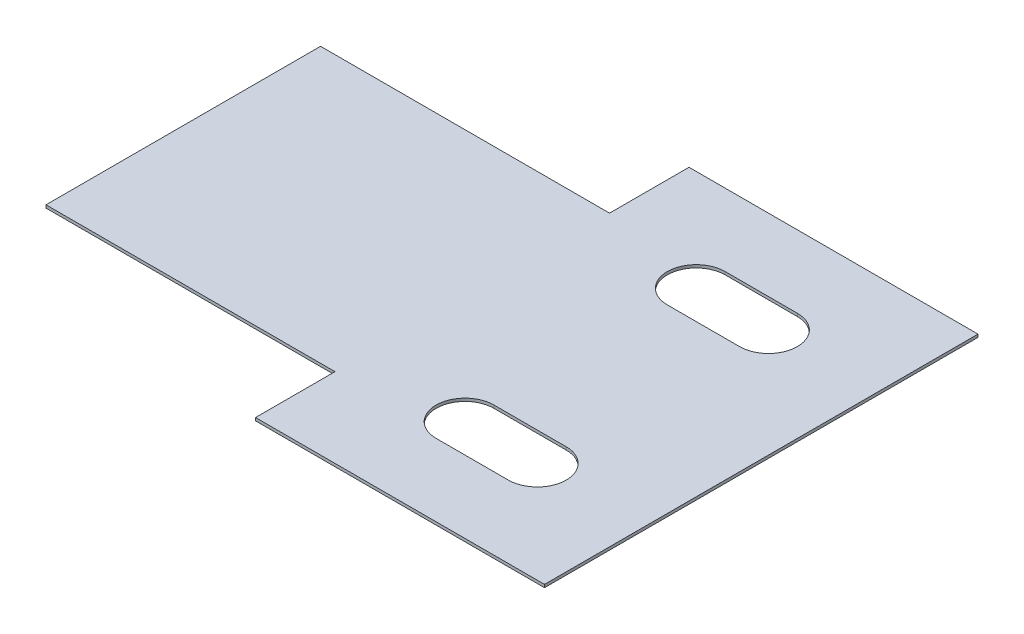
ISO-10303-21;
HEADER;
FILE_DESCRIPTION(('STEP AP214'),'2;1');
FILE_NAME('part.step','',(''),(''),'','','');
FILE_SCHEMA(('AUTOMOTIVE_DESIGN { 1 0 10303 214 1 1 1 1 }'));
ENDSEC;
DATA;
#1=APPLICATION_CONTEXT('core data for automotive mechanical design processes');
#2=APPLICATION_PROTOCOL_DEFINITION('international standard','automotive_design',2000,#1);
#3=PRODUCT_CONTEXT('',#1,'mechanical');
#4=PRODUCT('Part','Part','',(#3));
#5=PRODUCT_RELATED_PRODUCT_CATEGORY('part','',(#4));
#6=PRODUCT_DEFINITION_FORMATION('','',#4);
#7=PRODUCT_DEFINITION_CONTEXT('part definition',#1,'design');
#8=PRODUCT_DEFINITION('design','',#6,#7);
#9=PRODUCT_DEFINITION_SHAPE('','',#8);
#10=(LENGTH_UNIT() NAMED_UNIT(*) SI_UNIT(.MILLI.,.METRE.));
#11=(NAMED_UNIT(*) PLANE_ANGLE_UNIT() SI_UNIT($,.RADIAN.));
#12=(NAMED_UNIT(*) SI_UNIT($,.STERADIAN.) SOLID_ANGLE_UNIT());
#13=UNCERTAINTY_MEASURE_WITH_UNIT(LENGTH_MEASURE(1.E-05),#10,'distance_accuracy_value','');
#14=(GEOMETRIC_REPRESENTATION_CONTEXT(3) GLOBAL_UNCERTAINTY_ASSIGNED_CONTEXT((#13)) GLOBAL_UNIT_ASSIGNED_CONTEXT((#10,
#11,#12)) REPRESENTATION_CONTEXT('',''));
#15=CARTESIAN_POINT('',(0.,0.,0.));
#16=DIRECTION('',(0.,0.,1.));
#17=DIRECTION('',(1.,0.,0.));
#18=AXIS2_PLACEMENT_3D('',#15,#16,#17);
#19=CARTESIAN_POINT('',(0.,0.05,0.));
#20=DIRECTION('',(0.,1.,0.));
#21=DIRECTION('',(0.,0.,1.));
#22=AXIS2_PLACEMENT_3D('',#19,#20,#21);
#23=PLANE('',#22);
#24=DIRECTION('',(0.,0.,1.));
#25=VECTOR('',#24,1.);
#26=CARTESIAN_POINT('',(-3.77881475280006,0.05,-3.71273882483503));
#27=LINE('',#26,#25);
#28=CARTESIAN_POINT('',(-3.77881475280006,0.05,-3.71273882483503));
#29=VERTEX_POINT('',#28);
#30=CARTESIAN_POINT('',(-3.77881475280006,0.05,5.78726117516497));
#31=VERTEX_POINT('',#30);
#32=EDGE_CURVE('E244',#29,#31,#27,.T.);
#33=ORIENTED_EDGE('',*,*,#32,.T.);
#34=DIRECTION('',(1.,0.,0.));
#35=VECTOR('',#34,1.);
#36=CARTESIAN_POINT('',(-3.77881475280006,0.05,5.78726117516497));
#37=LINE('',#36,#35);
#38=CARTESIAN_POINT('',(6.22118524719994,0.05,5.78726117516497));
#39=VERTEX_POINT('',#38);
#40=EDGE_CURVE('E248',#31,#39,#37,.T.);
#41=ORIENTED_EDGE('',*,*,#40,.T.);
#42=DIRECTION('',(0.,0.,1.));
#43=VECTOR('',#42,1.);
#44=CARTESIAN_POINT('',(6.22118524719994,0.05,5.78726117516497));
#45=LINE('',#44,#43);
#46=CARTESIAN_POINT('',(6.22118524719994,0.05,8.53726117516497));
#47=VERTEX_POINT('',#46);
#48=EDGE_CURVE('E252',#39,#47,#45,.T.);
#49=ORIENTED_EDGE('',*,*,#48,.T.);
#50=DIRECTION('',(1.,0.,0.));
#51=VECTOR('',#50,1.);
#52=CARTESIAN_POINT('',(6.22118524719994,0.05,8.53726117516497));
#53=LINE('',#52,#51);
#54=CARTESIAN_POINT('',(16.2211852471999,0.05,8.53726117516497));
#55=VERTEX_POINT('',#54);
#56=EDGE_CURVE('E255',#47,#55,#53,.T.);
#57=ORIENTED_EDGE('',*,*,#56,.T.);
#58=DIRECTION('',(0.,0.,-1.));
#59=VECTOR('',#58,1.);
#60=CARTESIAN_POINT('',(16.2211852471999,0.05,8.53726117516497));
#61=LINE('',#60,#59);
#62=CARTESIAN_POINT('',(16.2211852471999,0.05,-6.46273882483503));
#63=VERTEX_POINT('',#62);
#64=EDGE_CURVE('E258',#55,#63,#61,.T.);
#65=ORIENTED_EDGE('',*,*,#64,.T.);
#66=DIRECTION('',(-1.,0.,0.));
#67=VECTOR('',#66,1.);
#68=CARTESIAN_POINT('',(16.2211852471999,0.05,-6.46273882483503));
#69=LINE('',#68,#67);
#70=CARTESIAN_POINT('',(6.22118524719994,0.05,-6.46273882483503));
#71=VERTEX_POINT('',#70);
#72=EDGE_CURVE('E261',#63,#71,#69,.T.);
#73=ORIENTED_EDGE('',*,*,#72,.T.);
#74=DIRECTION('',(0.,0.,1.));
#75=VECTOR('',#74,1.);
#76=CARTESIAN_POINT('',(6.22118524719994,0.05,-6.46273882483503));
#77=LINE('',#76,#75);
#78=CARTESIAN_POINT('',(6.22118524719994,0.05,-3.71273882483503));
#79=VERTEX_POINT('',#78);
#80=EDGE_CURVE('E264',#71,#79,#77,.T.);
#81=ORIENTED_EDGE('',*,*,#80,.T.);
#82=DIRECTION('',(-1.,0.,0.));
#83=VECTOR('',#82,1.);
#84=CARTESIAN_POINT('',(6.22118524719994,0.05,-3.71273882483503));
#85=LINE('',#84,#83);
#86=EDGE_CURVE('E267',#79,#29,#85,.T.);
#87=ORIENTED_EDGE('',*,*,#86,.T.);
#88=EDGE_LOOP('',(#33,#41,#49,#57,#65,#73,#81,#87));
#89=FACE_BOUND('',#88,.T.);
#90=DIRECTION('',(-1.,0.,0.));
#91=VECTOR('',#90,1.);
#92=CARTESIAN_POINT('',(12.4711852471999,0.05,-3.96273882483504));
#93=LINE('',#92,#91);
#94=CARTESIAN_POINT('',(12.4711852471999,0.05,-3.96273882483504));
#95=VERTEX_POINT('',#94);
#96=CARTESIAN_POINT('',(9.97118524719994,0.05,-3.96273882483504));
#97=VERTEX_POINT('',#96);
#98=EDGE_CURVE('E204',#95,#97,#93,.T.);
#99=ORIENTED_EDGE('',*,*,#98,.F.);
#100=CARTESIAN_POINT('',(12.4711852471999,0.05,-2.96273882483504));
#101=DIRECTION('',(0.,1.,0.));
#102=DIRECTION('',(0.,0.,1.));
#103=AXIS2_PLACEMENT_3D('',#100,#101,#102);
#104=CIRCLE('',#103,1.);
#105=CARTESIAN_POINT('',(12.4711852471999,0.05,-1.96273882483503));
#106=VERTEX_POINT('',#105);
#107=EDGE_CURVE('E201',#106,#95,#104,.T.);
#108=ORIENTED_EDGE('',*,*,#107,.F.);
#109=DIRECTION('',(1.,0.,0.));
#110=VECTOR('',#109,1.);
#111=CARTESIAN_POINT('',(9.97118524719994,0.05,-1.96273882483503));
#112=LINE('',#111,#110);
#113=CARTESIAN_POINT('',(9.97118524719994,0.05,-1.96273882483503));
#114=VERTEX_POINT('',#113);
#115=EDGE_CURVE('E212',#114,#106,#112,.T.);
#116=ORIENTED_EDGE('',*,*,#115,.F.);
#117=CARTESIAN_POINT('',(9.97118524719994,0.05,-2.96273882483504));
#118=DIRECTION('',(0.,1.,0.));
#119=DIRECTION('',(0.,0.,1.));
#120=AXIS2_PLACEMENT_3D('',#117,#118,#119);
#121=CIRCLE('',#120,1.);
#122=EDGE_CURVE('E208',#97,#114,#121,.T.);
#123=ORIENTED_EDGE('',*,*,#122,.F.);
#124=EDGE_LOOP('',(#99,#108,#116,#123));
#125=FACE_BOUND('',#124,.T.);
#126=DIRECTION('',(-1.,0.,0.));
#127=VECTOR('',#126,1.);
#128=CARTESIAN_POINT('',(12.4711852471999,0.05,4.03726117516496));
#129=LINE('',#128,#127);
#130=CARTESIAN_POINT('',(12.4711852471999,0.05,4.03726117516496));
#131=VERTEX_POINT('',#130);
#132=CARTESIAN_POINT('',(9.97118524719994,0.05,4.03726117516497));
#133=VERTEX_POINT('',#132);
#134=EDGE_CURVE('E162',#131,#133,#129,.T.);
#135=ORIENTED_EDGE('',*,*,#134,.F.);
#136=CARTESIAN_POINT('',(12.4711852471999,0.05,5.03726117516497));
#137=DIRECTION('',(0.,1.,0.));
#138=DIRECTION('',(0.,0.,1.));
#139=AXIS2_PLACEMENT_3D('',#136,#137,#138);
#140=CIRCLE('',#139,1.);
#141=CARTESIAN_POINT('',(12.4711852471999,0.05,6.03726117516497));
#142=VERTEX_POINT('',#141);
#143=EDGE_CURVE('E153',#142,#131,#140,.T.);
#144=ORIENTED_EDGE('',*,*,#143,.F.);
#145=DIRECTION('',(1.,0.,0.));
#146=VECTOR('',#145,1.);
#147=CARTESIAN_POINT('',(9.97118524719994,0.05,6.03726117516497));
#148=LINE('',#147,#146);
#149=CARTESIAN_POINT('',(9.97118524719994,0.05,6.03726117516497));
#150=VERTEX_POINT('',#149);
#151=EDGE_CURVE('E179',#150,#142,#148,.T.);
#152=ORIENTED_EDGE('',*,*,#151,.F.);
#153=CARTESIAN_POINT('',(9.97118524719994,0.05,5.03726117516497));
#154=DIRECTION('',(0.,1.,0.));
#155=DIRECTION('',(0.,0.,1.));
#156=AXIS2_PLACEMENT_3D('',#153,#154,#155);
#157=CIRCLE('',#156,1.);
#158=EDGE_CURVE('E175',#133,#150,#157,.T.);
#159=ORIENTED_EDGE('',*,*,#158,.F.);
#160=EDGE_LOOP('',(#135,#144,#152,#159));
#161=FACE_BOUND('',#160,.T.);
#162=ADVANCED_FACE('F39',(#89,#125,#161),#23,.T.);
#163=CARTESIAN_POINT('',(0.,-0.05,0.));
#164=DIRECTION('',(0.,1.,0.));
#165=DIRECTION('',(0.,0.,1.));
#166=AXIS2_PLACEMENT_3D('',#163,#164,#165);
#167=PLANE('',#166);
#168=CARTESIAN_POINT('',(12.4711852471999,-0.05,-2.96273882483504));
#169=DIRECTION('',(0.,1.,0.));
#170=DIRECTION('',(0.,0.,1.));
#171=AXIS2_PLACEMENT_3D('',#168,#169,#170);
#172=CIRCLE('',#171,1.);
#173=CARTESIAN_POINT('',(12.4711852471999,-0.05,-1.96273882483503));
#174=VERTEX_POINT('',#173);
#175=CARTESIAN_POINT('',(12.4711852471999,-0.05,-3.96273882483504));
#176=VERTEX_POINT('',#175);
#177=EDGE_CURVE('E171',#174,#176,#172,.T.);
#178=ORIENTED_EDGE('',*,*,#177,.T.);
#179=DIRECTION('',(-1.,0.,0.));
#180=VECTOR('',#179,1.);
#181=CARTESIAN_POINT('',(12.4711852471999,-0.05,-3.96273882483504));
#182=LINE('',#181,#180);
#183=CARTESIAN_POINT('',(9.97118524719994,-0.05,-3.96273882483504));
#184=VERTEX_POINT('',#183);
#185=EDGE_CURVE('E219',#176,#184,#182,.T.);
#186=ORIENTED_EDGE('',*,*,#185,.T.);
#187=CARTESIAN_POINT('',(9.97118524719994,-0.05,-2.96273882483504));
#188=DIRECTION('',(0.,1.,0.));
#189=DIRECTION('',(0.,0.,1.));
#190=AXIS2_PLACEMENT_3D('',#187,#188,#189);
#191=CIRCLE('',#190,1.);
#192=CARTESIAN_POINT('',(9.97118524719994,-0.05,-1.96273882483503));
#193=VERTEX_POINT('',#192);
#194=EDGE_CURVE('E223',#184,#193,#191,.T.);
#195=ORIENTED_EDGE('',*,*,#194,.T.);
#196=DIRECTION('',(1.,0.,0.));
#197=VECTOR('',#196,1.);
#198=CARTESIAN_POINT('',(9.97118524719994,-0.05,-1.96273882483503));
#199=LINE('',#198,#197);
#200=EDGE_CURVE('E205',#193,#174,#199,.T.);
#201=ORIENTED_EDGE('',*,*,#200,.T.);
#202=EDGE_LOOP('',(#178,#186,#195,#201));
#203=FACE_BOUND('',#202,.T.);
#204=DIRECTION('',(0.,0.,1.));
#205=VECTOR('',#204,1.);
#206=CARTESIAN_POINT('',(-3.77881475280006,-0.05,-3.71273882483503));
#207=LINE('',#206,#205);
#208=CARTESIAN_POINT('',(-3.77881475280006,-0.05,-3.71273882483503));
#209=VERTEX_POINT('',#208);
#210=CARTESIAN_POINT('',(-3.77881475280006,-0.05,5.78726117516497));
#211=VERTEX_POINT('',#210);
#212=EDGE_CURVE('E243',#209,#211,#207,.T.);
#213=ORIENTED_EDGE('',*,*,#212,.F.);
#214=DIRECTION('',(-1.,0.,0.));
#215=VECTOR('',#214,1.);
#216=CARTESIAN_POINT('',(6.22118524719994,-0.05,-3.71273882483503));
#217=LINE('',#216,#215);
#218=CARTESIAN_POINT('',(6.22118524719994,-0.05,-3.71273882483503));
#219=VERTEX_POINT('',#218);
#220=EDGE_CURVE('E249',#219,#209,#217,.T.);
#221=ORIENTED_EDGE('',*,*,#220,.F.);
#222=DIRECTION('',(0.,0.,1.));
#223=VECTOR('',#222,1.);
#224=CARTESIAN_POINT('',(6.22118524719994,-0.05,-6.46273882483503));
#225=LINE('',#224,#223);
#226=CARTESIAN_POINT('',(6.22118524719994,-0.05,-6.46273882483503));
#227=VERTEX_POINT('',#226);
#228=EDGE_CURVE('E289',#227,#219,#225,.T.);
#229=ORIENTED_EDGE('',*,*,#228,.F.);
#230=DIRECTION('',(-1.,0.,0.));
#231=VECTOR('',#230,1.);
#232=CARTESIAN_POINT('',(16.2211852471999,-0.05,-6.46273882483503));
#233=LINE('',#232,#231);
#234=CARTESIAN_POINT('',(16.2211852471999,-0.05,-6.46273882483503));
#235=VERTEX_POINT('',#234);
#236=EDGE_CURVE('E286',#235,#227,#233,.T.);
#237=ORIENTED_EDGE('',*,*,#236,.F.);
#238=DIRECTION('',(0.,0.,-1.));
#239=VECTOR('',#238,1.);
#240=CARTESIAN_POINT('',(16.2211852471999,-0.05,8.53726117516497));
#241=LINE('',#240,#239);
#242=CARTESIAN_POINT('',(16.2211852471999,-0.05,8.53726117516497));
#243=VERTEX_POINT('',#242);
#244=EDGE_CURVE('E283',#243,#235,#241,.T.);
#245=ORIENTED_EDGE('',*,*,#244,.F.);
#246=DIRECTION('',(1.,0.,0.));
#247=VECTOR('',#246,1.);
#248=CARTESIAN_POINT('',(6.22118524719994,-0.05,8.53726117516497));
#249=LINE('',#248,#247);
#250=CARTESIAN_POINT('',(6.22118524719994,-0.05,8.53726117516497));
#251=VERTEX_POINT('',#250);
#252=EDGE_CURVE('E280',#251,#243,#249,.T.);
#253=ORIENTED_EDGE('',*,*,#252,.F.);
#254=DIRECTION('',(0.,0.,1.));
#255=VECTOR('',#254,1.);
#256=CARTESIAN_POINT('',(6.22118524719994,-0.05,5.78726117516497));
#257=LINE('',#256,#255);
#258=CARTESIAN_POINT('',(6.22118524719994,-0.05,5.78726117516497));
#259=VERTEX_POINT('',#258);
#260=EDGE_CURVE('E277',#259,#251,#257,.T.);
#261=ORIENTED_EDGE('',*,*,#260,.F.);
#262=DIRECTION('',(1.,0.,0.));
#263=VECTOR('',#262,1.);
#264=CARTESIAN_POINT('',(-3.77881475280006,-0.05,5.78726117516497));
#265=LINE('',#264,#263);
#266=EDGE_CURVE('E274',#211,#259,#265,.T.);
#267=ORIENTED_EDGE('',*,*,#266,.F.);
#268=EDGE_LOOP('',(#213,#221,#229,#237,#245,#253,#261,#267));
#269=FACE_BOUND('',#268,.T.);
#270=CARTESIAN_POINT('',(12.4711852471999,-0.05,5.03726117516497));
#271=DIRECTION('',(0.,1.,0.));
#272=DIRECTION('',(0.,0.,1.));
#273=AXIS2_PLACEMENT_3D('',#270,#271,#272);
#274=CIRCLE('',#273,1.);
#275=CARTESIAN_POINT('',(12.4711852471999,-0.05,6.03726117516497));
#276=VERTEX_POINT('',#275);
#277=CARTESIAN_POINT('',(12.4711852471999,-0.05,4.03726117516496));
#278=VERTEX_POINT('',#277);
#279=EDGE_CURVE('E63',#276,#278,#274,.T.);
#280=ORIENTED_EDGE('',*,*,#279,.T.);
#281=DIRECTION('',(-1.,0.,0.));
#282=VECTOR('',#281,1.);
#283=CARTESIAN_POINT('',(12.4711852471999,-0.05,4.03726117516496));
#284=LINE('',#283,#282);
#285=CARTESIAN_POINT('',(9.97118524719994,-0.05,4.03726117516497));
#286=VERTEX_POINT('',#285);
#287=EDGE_CURVE('E169',#278,#286,#284,.T.);
#288=ORIENTED_EDGE('',*,*,#287,.T.);
#289=CARTESIAN_POINT('',(9.97118524719994,-0.05,5.03726117516497));
#290=DIRECTION('',(0.,1.,0.));
#291=DIRECTION('',(0.,0.,1.));
#292=AXIS2_PLACEMENT_3D('',#289,#290,#291);
#293=CIRCLE('',#292,1.);
#294=CARTESIAN_POINT('',(9.97118524719994,-0.05,6.03726117516497));
#295=VERTEX_POINT('',#294);
#296=EDGE_CURVE('E188',#286,#295,#293,.T.);
#297=ORIENTED_EDGE('',*,*,#296,.T.);
#298=DIRECTION('',(1.,0.,0.));
#299=VECTOR('',#298,1.);
#300=CARTESIAN_POINT('',(9.97118524719994,-0.05,6.03726117516497));
#301=LINE('',#300,#299);
#302=EDGE_CURVE('E163',#295,#276,#301,.T.);
#303=ORIENTED_EDGE('',*,*,#302,.T.);
#304=EDGE_LOOP('',(#280,#288,#297,#303));
#305=FACE_BOUND('',#304,.T.);
#306=ADVANCED_FACE('F328',(#203,#269,#305),#167,.F.);
#307=CARTESIAN_POINT('',(-3.77881475280006,0.05,-3.71273882483503));
#308=DIRECTION('',(1.,0.,0.));
#309=DIRECTION('',(0.,0.,-1.));
#310=AXIS2_PLACEMENT_3D('',#307,#308,#309);
#311=PLANE('',#310);
#312=ORIENTED_EDGE('',*,*,#212,.T.);
#313=DIRECTION('',(0.,-1.,0.));
#314=VECTOR('',#313,1.);
#315=CARTESIAN_POINT('',(-3.77881475280006,0.05,5.78726117516497));
#316=LINE('',#315,#314);
#317=EDGE_CURVE('E11',#31,#211,#316,.T.);
#318=ORIENTED_EDGE('',*,*,#317,.F.);
#319=ORIENTED_EDGE('',*,*,#32,.F.);
#320=DIRECTION('',(0.,-1.,0.));
#321=VECTOR('',#320,1.);
#322=CARTESIAN_POINT('',(-3.77881475280006,0.05,-3.71273882483503));
#323=LINE('',#322,#321);
#324=EDGE_CURVE('E270',#29,#209,#323,.T.);
#325=ORIENTED_EDGE('',*,*,#324,.T.);
#326=EDGE_LOOP('',(#312,#318,#319,#325));
#327=FACE_BOUND('',#326,.T.);
#328=ADVANCED_FACE('F41',(#327),#311,.F.);
#329=CARTESIAN_POINT('',(-3.77881475280006,0.05,5.78726117516497));
#330=DIRECTION('',(0.,0.,-1.));
#331=DIRECTION('',(-1.,0.,0.));
#332=AXIS2_PLACEMENT_3D('',#329,#330,#331);
#333=PLANE('',#332);
#334=ORIENTED_EDGE('',*,*,#266,.T.);
#335=DIRECTION('',(0.,-1.,0.));
#336=VECTOR('',#335,1.);
#337=CARTESIAN_POINT('',(6.22118524719994,0.05,5.78726117516497));
#338=LINE('',#337,#336);
#339=EDGE_CURVE('E48',#39,#259,#338,.T.);
#340=ORIENTED_EDGE('',*,*,#339,.F.);
#341=ORIENTED_EDGE('',*,*,#40,.F.);
#342=ORIENTED_EDGE('',*,*,#317,.T.);
#343=EDGE_LOOP('',(#334,#340,#341,#342));
#344=FACE_BOUND('',#343,.T.);
#345=ADVANCED_FACE('F346',(#344),#333,.F.);
#346=CARTESIAN_POINT('',(6.22118524719994,0.05,5.78726117516497));
#347=DIRECTION('',(1.,0.,0.));
#348=DIRECTION('',(0.,0.,-1.));
#349=AXIS2_PLACEMENT_3D('',#346,#347,#348);
#350=PLANE('',#349);
#351=ORIENTED_EDGE('',*,*,#260,.T.);
#352=DIRECTION('',(0.,-1.,0.));
#353=VECTOR('',#352,1.);
#354=CARTESIAN_POINT('',(6.22118524719994,0.05,8.53726117516497));
#355=LINE('',#354,#353);
#356=EDGE_CURVE('E313',#47,#251,#355,.T.);
#357=ORIENTED_EDGE('',*,*,#356,.F.);
#358=ORIENTED_EDGE('',*,*,#48,.F.);
#359=ORIENTED_EDGE('',*,*,#339,.T.);
#360=EDGE_LOOP('',(#351,#357,#358,#359));
#361=FACE_BOUND('',#360,.T.);
#362=ADVANCED_FACE('F322',(#361),#350,.F.);
#363=CARTESIAN_POINT('',(6.22118524719994,0.05,8.53726117516497));
#364=DIRECTION('',(0.,0.,-1.));
#365=DIRECTION('',(-1.,0.,0.));
#366=AXIS2_PLACEMENT_3D('',#363,#364,#365);
#367=PLANE('',#366);
#368=ORIENTED_EDGE('',*,*,#252,.T.);
#369=DIRECTION('',(0.,-1.,0.));
#370=VECTOR('',#369,1.);
#371=CARTESIAN_POINT('',(16.2211852471999,0.05,8.53726117516497));
#372=LINE('',#371,#370);
#373=EDGE_CURVE('E309',#55,#243,#372,.T.);
#374=ORIENTED_EDGE('',*,*,#373,.F.);
#375=ORIENTED_EDGE('',*,*,#56,.F.);
#376=ORIENTED_EDGE('',*,*,#356,.T.);
#377=EDGE_LOOP('',(#368,#374,#375,#376));
#378=FACE_BOUND('',#377,.T.);
#379=ADVANCED_FACE('F334',(#378),#367,.F.);
#380=CARTESIAN_POINT('',(16.2211852471999,0.05,8.53726117516497));
#381=DIRECTION('',(-1.,0.,0.));
#382=DIRECTION('',(0.,0.,1.));
#383=AXIS2_PLACEMENT_3D('',#380,#381,#382);
#384=PLANE('',#383);
#385=ORIENTED_EDGE('',*,*,#244,.T.);
#386=DIRECTION('',(0.,-1.,0.));
#387=VECTOR('',#386,1.);
#388=CARTESIAN_POINT('',(16.2211852471999,0.05,-6.46273882483503));
#389=LINE('',#388,#387);
#390=EDGE_CURVE('E305',#63,#235,#389,.T.);
#391=ORIENTED_EDGE('',*,*,#390,.F.);
#392=ORIENTED_EDGE('',*,*,#64,.F.);
#393=ORIENTED_EDGE('',*,*,#373,.T.);
#394=EDGE_LOOP('',(#385,#391,#392,#393));
#395=FACE_BOUND('',#394,.T.);
#396=ADVANCED_FACE('F338',(#395),#384,.F.);
#397=CARTESIAN_POINT('',(16.2211852471999,0.05,-6.46273882483503));
#398=DIRECTION('',(0.,0.,1.));
#399=DIRECTION('',(1.,0.,0.));
#400=AXIS2_PLACEMENT_3D('',#397,#398,#399);
#401=PLANE('',#400);
#402=ORIENTED_EDGE('',*,*,#236,.T.);
#403=DIRECTION('',(0.,-1.,0.));
#404=VECTOR('',#403,1.);
#405=CARTESIAN_POINT('',(6.22118524719994,0.05,-6.46273882483503));
#406=LINE('',#405,#404);
#407=EDGE_CURVE('E301',#71,#227,#406,.T.);
#408=ORIENTED_EDGE('',*,*,#407,.F.);
#409=ORIENTED_EDGE('',*,*,#72,.F.);
#410=ORIENTED_EDGE('',*,*,#390,.T.);
#411=EDGE_LOOP('',(#402,#408,#409,#410));
#412=FACE_BOUND('',#411,.T.);
#413=ADVANCED_FACE('F359',(#412),#401,.F.);
#414=CARTESIAN_POINT('',(6.22118524719994,0.05,-6.46273882483503));
#415=DIRECTION('',(1.,0.,0.));
#416=DIRECTION('',(0.,0.,-1.));
#417=AXIS2_PLACEMENT_3D('',#414,#415,#416);
#418=PLANE('',#417);
#419=ORIENTED_EDGE('',*,*,#228,.T.);
#420=DIRECTION('',(0.,-1.,0.));
#421=VECTOR('',#420,1.);
#422=CARTESIAN_POINT('',(6.22118524719994,0.05,-3.71273882483503));
#423=LINE('',#422,#421);
#424=EDGE_CURVE('E297',#79,#219,#423,.T.);
#425=ORIENTED_EDGE('',*,*,#424,.F.);
#426=ORIENTED_EDGE('',*,*,#80,.F.);
#427=ORIENTED_EDGE('',*,*,#407,.T.);
#428=EDGE_LOOP('',(#419,#425,#426,#427));
#429=FACE_BOUND('',#428,.T.);
#430=ADVANCED_FACE('F357',(#429),#418,.F.);
#431=CARTESIAN_POINT('',(6.22118524719994,0.05,-3.71273882483503));
#432=DIRECTION('',(0.,0.,1.));
#433=DIRECTION('',(1.,0.,0.));
#434=AXIS2_PLACEMENT_3D('',#431,#432,#433);
#435=PLANE('',#434);
#436=ORIENTED_EDGE('',*,*,#220,.T.);
#437=ORIENTED_EDGE('',*,*,#324,.F.);
#438=ORIENTED_EDGE('',*,*,#86,.F.);
#439=ORIENTED_EDGE('',*,*,#424,.T.);
#440=EDGE_LOOP('',(#436,#437,#438,#439));
#441=FACE_BOUND('',#440,.T.);
#442=ADVANCED_FACE('F352',(#441),#435,.F.);
#443=CARTESIAN_POINT('',(12.4711852471999,0.05,-2.96273882483504));
#444=DIRECTION('',(0.,-1.,0.));
#445=DIRECTION('',(0.,0.,-1.));
#446=AXIS2_PLACEMENT_3D('',#443,#444,#445);
#447=CYLINDRICAL_SURFACE('',#446,1.);
#448=ORIENTED_EDGE('',*,*,#177,.F.);
#449=DIRECTION('',(0.,-1.,0.));
#450=VECTOR('',#449,1.);
#451=CARTESIAN_POINT('',(12.4711852471999,0.05,-1.96273882483503));
#452=LINE('',#451,#450);
#453=EDGE_CURVE('E215',#106,#174,#452,.T.);
#454=ORIENTED_EDGE('',*,*,#453,.F.);
#455=ORIENTED_EDGE('',*,*,#107,.T.);
#456=DIRECTION('',(0.,-1.,0.));
#457=VECTOR('',#456,1.);
#458=CARTESIAN_POINT('',(12.4711852471999,0.05,-3.96273882483504));
#459=LINE('',#458,#457);
#460=EDGE_CURVE('E239',#95,#176,#459,.T.);
#461=ORIENTED_EDGE('',*,*,#460,.T.);
#462=EDGE_LOOP('',(#448,#454,#455,#461));
#463=FACE_BOUND('',#462,.T.);
#464=ADVANCED_FACE('F376',(#463),#447,.F.);
#465=CARTESIAN_POINT('',(12.4711852471999,0.05,-3.96273882483504));
#466=DIRECTION('',(0.,0.,1.));
#467=DIRECTION('',(1.,0.,0.));
#468=AXIS2_PLACEMENT_3D('',#465,#466,#467);
#469=PLANE('',#468);
#470=ORIENTED_EDGE('',*,*,#185,.F.);
#471=ORIENTED_EDGE('',*,*,#460,.F.);
#472=ORIENTED_EDGE('',*,*,#98,.T.);
#473=DIRECTION('',(0.,-1.,0.));
#474=VECTOR('',#473,1.);
#475=CARTESIAN_POINT('',(9.97118524719994,0.05,-3.96273882483504));
#476=LINE('',#475,#474);
#477=EDGE_CURVE('E236',#97,#184,#476,.T.);
#478=ORIENTED_EDGE('',*,*,#477,.T.);
#479=EDGE_LOOP('',(#470,#471,#472,#478));
#480=FACE_BOUND('',#479,.T.);
#481=ADVANCED_FACE('F383',(#480),#469,.T.);
#482=CARTESIAN_POINT('',(9.97118524719994,0.05,-2.96273882483504));
#483=DIRECTION('',(0.,-1.,0.));
#484=DIRECTION('',(0.,0.,-1.));
#485=AXIS2_PLACEMENT_3D('',#482,#483,#484);
#486=CYLINDRICAL_SURFACE('',#485,1.);
#487=ORIENTED_EDGE('',*,*,#194,.F.);
#488=ORIENTED_EDGE('',*,*,#477,.F.);
#489=ORIENTED_EDGE('',*,*,#122,.T.);
#490=DIRECTION('',(0.,-1.,0.));
#491=VECTOR('',#490,1.);
#492=CARTESIAN_POINT('',(9.97118524719994,0.05,-1.96273882483503));
#493=LINE('',#492,#491);
#494=EDGE_CURVE('E233',#114,#193,#493,.T.);
#495=ORIENTED_EDGE('',*,*,#494,.T.);
#496=EDGE_LOOP('',(#487,#488,#489,#495));
#497=FACE_BOUND('',#496,.T.);
#498=ADVANCED_FACE('F388',(#497),#486,.F.);
#499=CARTESIAN_POINT('',(9.97118524719994,0.05,-1.96273882483503));
#500=DIRECTION('',(0.,0.,-1.));
#501=DIRECTION('',(-1.,0.,0.));
#502=AXIS2_PLACEMENT_3D('',#499,#500,#501);
#503=PLANE('',#502);
#504=ORIENTED_EDGE('',*,*,#200,.F.);
#505=ORIENTED_EDGE('',*,*,#494,.F.);
#506=ORIENTED_EDGE('',*,*,#115,.T.);
#507=ORIENTED_EDGE('',*,*,#453,.T.);
#508=EDGE_LOOP('',(#504,#505,#506,#507));
#509=FACE_BOUND('',#508,.T.);
#510=ADVANCED_FACE('F395',(#509),#503,.T.);
#511=CARTESIAN_POINT('',(12.4711852471999,0.05,5.03726117516497));
#512=DIRECTION('',(0.,-1.,0.));
#513=DIRECTION('',(0.,0.,-1.));
#514=AXIS2_PLACEMENT_3D('',#511,#512,#513);
#515=CYLINDRICAL_SURFACE('',#514,1.);
#516=ORIENTED_EDGE('',*,*,#279,.F.);
#517=DIRECTION('',(0.,-1.,0.));
#518=VECTOR('',#517,1.);
#519=CARTESIAN_POINT('',(12.4711852471999,0.05,6.03726117516497));
#520=LINE('',#519,#518);
#521=EDGE_CURVE('E157',#142,#276,#520,.T.);
#522=ORIENTED_EDGE('',*,*,#521,.F.);
#523=ORIENTED_EDGE('',*,*,#143,.T.);
#524=DIRECTION('',(0.,-1.,0.));
#525=VECTOR('',#524,1.);
#526=CARTESIAN_POINT('',(12.4711852471999,0.05,4.03726117516496));
#527=LINE('',#526,#525);
#528=EDGE_CURVE('E156',#131,#278,#527,.T.);
#529=ORIENTED_EDGE('',*,*,#528,.T.);
#530=EDGE_LOOP('',(#516,#522,#523,#529));
#531=FACE_BOUND('',#530,.T.);
#532=ADVANCED_FACE('F155',(#531),#515,.F.);
#533=CARTESIAN_POINT('',(12.4711852471999,0.05,4.03726117516496));
#534=DIRECTION('',(0.,0.,1.));
#535=DIRECTION('',(1.,0.,0.));
#536=AXIS2_PLACEMENT_3D('',#533,#534,#535);
#537=PLANE('',#536);
#538=ORIENTED_EDGE('',*,*,#287,.F.);
#539=ORIENTED_EDGE('',*,*,#528,.F.);
#540=ORIENTED_EDGE('',*,*,#134,.T.);
#541=DIRECTION('',(0.,-1.,0.));
#542=VECTOR('',#541,1.);
#543=CARTESIAN_POINT('',(9.97118524719994,0.05,4.03726117516497));
#544=LINE('',#543,#542);
#545=EDGE_CURVE('E172',#133,#286,#544,.T.);
#546=ORIENTED_EDGE('',*,*,#545,.T.);
#547=EDGE_LOOP('',(#538,#539,#540,#546));
#548=FACE_BOUND('',#547,.T.);
#549=ADVANCED_FACE('F166',(#548),#537,.T.);
#550=CARTESIAN_POINT('',(9.97118524719994,0.05,5.03726117516497));
#551=DIRECTION('',(0.,-1.,0.));
#552=DIRECTION('',(0.,0.,-1.));
#553=AXIS2_PLACEMENT_3D('',#550,#551,#552);
#554=CYLINDRICAL_SURFACE('',#553,1.);
#555=ORIENTED_EDGE('',*,*,#296,.F.);
#556=ORIENTED_EDGE('',*,*,#545,.F.);
#557=ORIENTED_EDGE('',*,*,#158,.T.);
#558=DIRECTION('',(0.,-1.,0.));
#559=VECTOR('',#558,1.);
#560=CARTESIAN_POINT('',(9.97118524719994,0.05,6.03726117516497));
#561=LINE('',#560,#559);
#562=EDGE_CURVE('E55',#150,#295,#561,.T.);
#563=ORIENTED_EDGE('',*,*,#562,.T.);
#564=EDGE_LOOP('',(#555,#556,#557,#563));
#565=FACE_BOUND('',#564,.T.);
#566=ADVANCED_FACE('F413',(#565),#554,.F.);
#567=CARTESIAN_POINT('',(9.97118524719994,0.05,6.03726117516497));
#568=DIRECTION('',(0.,0.,-1.));
#569=DIRECTION('',(-1.,0.,0.));
#570=AXIS2_PLACEMENT_3D('',#567,#568,#569);
#571=PLANE('',#570);
#572=ORIENTED_EDGE('',*,*,#302,.F.);
#573=ORIENTED_EDGE('',*,*,#562,.F.);
#574=ORIENTED_EDGE('',*,*,#151,.T.);
#575=ORIENTED_EDGE('',*,*,#521,.T.);
#576=EDGE_LOOP('',(#572,#573,#574,#575));
#577=FACE_BOUND('',#576,.T.);
#578=ADVANCED_FACE('F416',(#577),#571,.T.);
#579=CLOSED_SHELL('',(#162,#306,#328,#345,#362,#379,#396,#413,#430,#442,#464,#481,#498,#510,
#532,#549,#566,#578));
#580=MANIFOLD_SOLID_BREP('B2',#579);
#581=ADVANCED_BREP_SHAPE_REPRESENTATION('',(#18,#580),#14);
#582=SHAPE_DEFINITION_REPRESENTATION(#9,#581);
ENDSEC;
END-ISO-10303-21;
